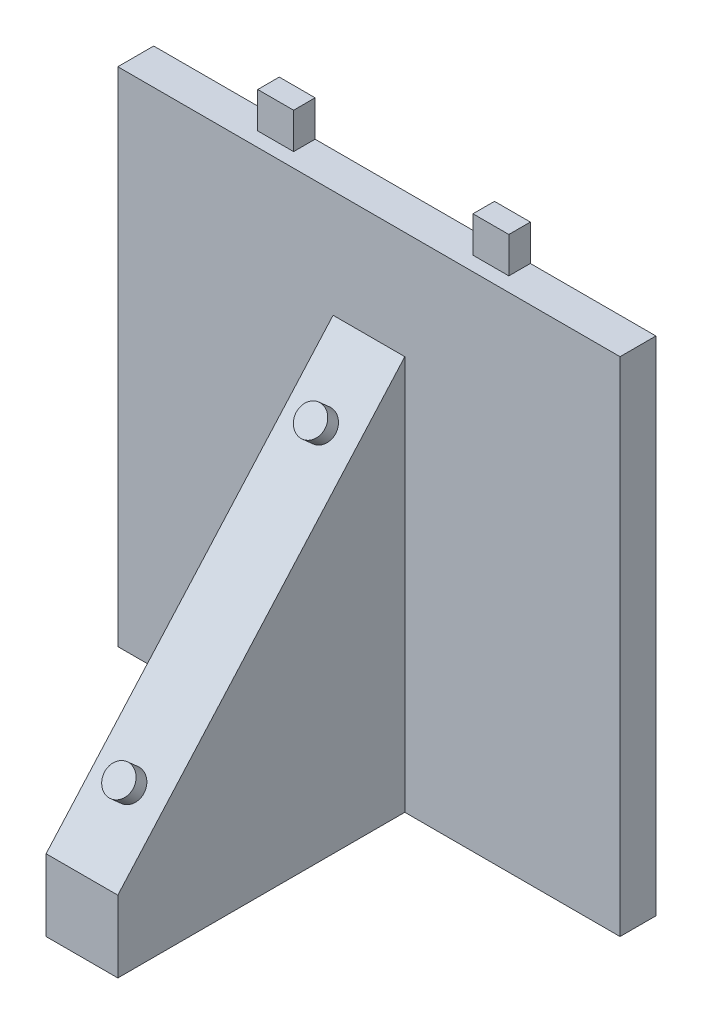
ISO-10303-21;
HEADER;
FILE_DESCRIPTION(('STEP AP214'),'2;1');
FILE_NAME('part.step','',(''),(''),'','','');
FILE_SCHEMA(('AUTOMOTIVE_DESIGN { 1 0 10303 214 1 1 1 1 }'));
ENDSEC;
DATA;
#1=APPLICATION_CONTEXT('core data for automotive mechanical design processes');
#2=APPLICATION_PROTOCOL_DEFINITION('international standard','automotive_design',2000,#1);
#3=PRODUCT_CONTEXT('',#1,'mechanical');
#4=PRODUCT('Part','Part','',(#3));
#5=PRODUCT_RELATED_PRODUCT_CATEGORY('part','',(#4));
#6=PRODUCT_DEFINITION_FORMATION('','',#4);
#7=PRODUCT_DEFINITION_CONTEXT('part definition',#1,'design');
#8=PRODUCT_DEFINITION('design','',#6,#7);
#9=PRODUCT_DEFINITION_SHAPE('','',#8);
#10=(LENGTH_UNIT() NAMED_UNIT(*) SI_UNIT(.MILLI.,.METRE.));
#11=(NAMED_UNIT(*) PLANE_ANGLE_UNIT() SI_UNIT($,.RADIAN.));
#12=(NAMED_UNIT(*) SI_UNIT($,.STERADIAN.) SOLID_ANGLE_UNIT());
#13=UNCERTAINTY_MEASURE_WITH_UNIT(LENGTH_MEASURE(1.E-05),#10,'distance_accuracy_value','');
#14=(GEOMETRIC_REPRESENTATION_CONTEXT(3) GLOBAL_UNCERTAINTY_ASSIGNED_CONTEXT((#13)) GLOBAL_UNIT_ASSIGNED_CONTEXT((#10,
#11,#12)) REPRESENTATION_CONTEXT('',''));
#15=CARTESIAN_POINT('',(0.,0.,0.));
#16=DIRECTION('',(0.,0.,1.));
#17=DIRECTION('',(1.,0.,0.));
#18=AXIS2_PLACEMENT_3D('',#15,#16,#17);
#19=CARTESIAN_POINT('',(0.,0.,5.));
#20=DIRECTION('',(0.,0.,-1.));
#21=DIRECTION('',(-1.,0.,0.));
#22=AXIS2_PLACEMENT_3D('',#19,#20,#21);
#23=PLANE('',#22);
#24=DIRECTION('',(0.,1.,0.));
#25=VECTOR('',#24,1.);
#26=CARTESIAN_POINT('',(5.,-35.,5.));
#27=LINE('',#26,#25);
#28=CARTESIAN_POINT('',(5.,-35.,5.));
#29=VERTEX_POINT('',#28);
#30=CARTESIAN_POINT('',(5.,20.,5.));
#31=VERTEX_POINT('',#30);
#32=EDGE_CURVE('E162',#29,#31,#27,.T.);
#33=ORIENTED_EDGE('',*,*,#32,.F.);
#34=DIRECTION('',(1.,0.,0.));
#35=VECTOR('',#34,1.);
#36=CARTESIAN_POINT('',(35.,-35.,5.));
#37=LINE('',#36,#35);
#38=CARTESIAN_POINT('',(35.,-35.,5.));
#39=VERTEX_POINT('',#38);
#40=EDGE_CURVE('E250',#29,#39,#37,.T.);
#41=ORIENTED_EDGE('',*,*,#40,.T.);
#42=DIRECTION('',(0.,1.,0.));
#43=VECTOR('',#42,1.);
#44=CARTESIAN_POINT('',(35.,-35.,5.));
#45=LINE('',#44,#43);
#46=CARTESIAN_POINT('',(35.,35.,5.));
#47=VERTEX_POINT('',#46);
#48=EDGE_CURVE('E253',#39,#47,#45,.T.);
#49=ORIENTED_EDGE('',*,*,#48,.T.);
#50=DIRECTION('',(-1.,0.,0.));
#51=VECTOR('',#50,1.);
#52=CARTESIAN_POINT('',(35.,35.,5.));
#53=LINE('',#52,#51);
#54=CARTESIAN_POINT('',(-35.,35.,5.));
#55=VERTEX_POINT('',#54);
#56=EDGE_CURVE('E245',#47,#55,#53,.T.);
#57=ORIENTED_EDGE('',*,*,#56,.T.);
#58=DIRECTION('',(0.,-1.,0.));
#59=VECTOR('',#58,1.);
#60=CARTESIAN_POINT('',(-35.,-35.,5.));
#61=LINE('',#60,#59);
#62=CARTESIAN_POINT('',(-35.,-35.,5.));
#63=VERTEX_POINT('',#62);
#64=EDGE_CURVE('E241',#55,#63,#61,.T.);
#65=ORIENTED_EDGE('',*,*,#64,.T.);
#66=CARTESIAN_POINT('',(-5.,-35.,5.));
#67=VERTEX_POINT('',#66);
#68=EDGE_CURVE('E246',#63,#67,#37,.T.);
#69=ORIENTED_EDGE('',*,*,#68,.T.);
#70=DIRECTION('',(0.,1.,0.));
#71=VECTOR('',#70,1.);
#72=CARTESIAN_POINT('',(-5.,-35.,5.));
#73=LINE('',#72,#71);
#74=CARTESIAN_POINT('',(-5.,20.,5.));
#75=VERTEX_POINT('',#74);
#76=EDGE_CURVE('E174',#67,#75,#73,.T.);
#77=ORIENTED_EDGE('',*,*,#76,.T.);
#78=DIRECTION('',(1.,0.,0.));
#79=VECTOR('',#78,1.);
#80=CARTESIAN_POINT('',(-5.,20.,5.));
#81=LINE('',#80,#79);
#82=EDGE_CURVE('E156',#75,#31,#81,.T.);
#83=ORIENTED_EDGE('',*,*,#82,.T.);
#84=EDGE_LOOP('',(#33,#41,#49,#57,#65,#69,#77,#83));
#85=FACE_BOUND('',#84,.T.);
#86=ADVANCED_FACE('F39',(#85),#23,.F.);
#87=CARTESIAN_POINT('',(35.,35.,5.));
#88=DIRECTION('',(0.,-1.,0.));
#89=DIRECTION('',(0.,0.,-1.));
#90=AXIS2_PLACEMENT_3D('',#87,#88,#89);
#91=PLANE('',#90);
#92=DIRECTION('',(0.,0.,1.));
#93=VECTOR('',#92,1.);
#94=CARTESIAN_POINT('',(12.5,35.,0.));
#95=LINE('',#94,#93);
#96=CARTESIAN_POINT('',(12.5,35.,0.));
#97=VERTEX_POINT('',#96);
#98=CARTESIAN_POINT('',(12.5,35.,3.));
#99=VERTEX_POINT('',#98);
#100=EDGE_CURVE('E193',#97,#99,#95,.T.);
#101=ORIENTED_EDGE('',*,*,#100,.F.);
#102=DIRECTION('',(-1.,0.,0.));
#103=VECTOR('',#102,1.);
#104=CARTESIAN_POINT('',(35.,35.,0.));
#105=LINE('',#104,#103);
#106=CARTESIAN_POINT('',(-12.5,35.,0.));
#107=VERTEX_POINT('',#106);
#108=EDGE_CURVE('E260',#97,#107,#105,.T.);
#109=ORIENTED_EDGE('',*,*,#108,.T.);
#110=DIRECTION('',(0.,0.,-1.));
#111=VECTOR('',#110,1.);
#112=CARTESIAN_POINT('',(-12.5,35.,0.));
#113=LINE('',#112,#111);
#114=CARTESIAN_POINT('',(-12.5,35.,3.));
#115=VERTEX_POINT('',#114);
#116=EDGE_CURVE('E227',#115,#107,#113,.T.);
#117=ORIENTED_EDGE('',*,*,#116,.F.);
#118=DIRECTION('',(1.,0.,0.));
#119=VECTOR('',#118,1.);
#120=CARTESIAN_POINT('',(-17.5,35.,3.));
#121=LINE('',#120,#119);
#122=CARTESIAN_POINT('',(-17.5,35.,3.));
#123=VERTEX_POINT('',#122);
#124=EDGE_CURVE('E229',#123,#115,#121,.T.);
#125=ORIENTED_EDGE('',*,*,#124,.F.);
#126=DIRECTION('',(0.,0.,1.));
#127=VECTOR('',#126,1.);
#128=CARTESIAN_POINT('',(-17.5,35.,0.));
#129=LINE('',#128,#127);
#130=CARTESIAN_POINT('',(-17.5,35.,0.));
#131=VERTEX_POINT('',#130);
#132=EDGE_CURVE('E196',#131,#123,#129,.T.);
#133=ORIENTED_EDGE('',*,*,#132,.F.);
#134=CARTESIAN_POINT('',(-35.,35.,0.));
#135=VERTEX_POINT('',#134);
#136=EDGE_CURVE('E215',#131,#135,#105,.T.);
#137=ORIENTED_EDGE('',*,*,#136,.T.);
#138=DIRECTION('',(0.,0.,-1.));
#139=VECTOR('',#138,1.);
#140=CARTESIAN_POINT('',(-35.,35.,5.));
#141=LINE('',#140,#139);
#142=EDGE_CURVE('E11',#55,#135,#141,.T.);
#143=ORIENTED_EDGE('',*,*,#142,.F.);
#144=ORIENTED_EDGE('',*,*,#56,.F.);
#145=DIRECTION('',(0.,0.,-1.));
#146=VECTOR('',#145,1.);
#147=CARTESIAN_POINT('',(35.,35.,5.));
#148=LINE('',#147,#146);
#149=CARTESIAN_POINT('',(35.,35.,0.));
#150=VERTEX_POINT('',#149);
#151=EDGE_CURVE('E251',#47,#150,#148,.T.);
#152=ORIENTED_EDGE('',*,*,#151,.T.);
#153=CARTESIAN_POINT('',(17.5,35.,0.));
#154=VERTEX_POINT('',#153);
#155=EDGE_CURVE('E255',#150,#154,#105,.T.);
#156=ORIENTED_EDGE('',*,*,#155,.T.);
#157=DIRECTION('',(0.,0.,-1.));
#158=VECTOR('',#157,1.);
#159=CARTESIAN_POINT('',(17.5,35.,0.));
#160=LINE('',#159,#158);
#161=CARTESIAN_POINT('',(17.5,35.,3.));
#162=VERTEX_POINT('',#161);
#163=EDGE_CURVE('E188',#162,#154,#160,.T.);
#164=ORIENTED_EDGE('',*,*,#163,.F.);
#165=DIRECTION('',(1.,0.,0.));
#166=VECTOR('',#165,1.);
#167=CARTESIAN_POINT('',(17.5,35.,3.));
#168=LINE('',#167,#166);
#169=EDGE_CURVE('E65',#99,#162,#168,.T.);
#170=ORIENTED_EDGE('',*,*,#169,.F.);
#171=EDGE_LOOP('',(#101,#109,#117,#125,#133,#137,#143,#144,#152,#156,#164,#170));
#172=FACE_BOUND('',#171,.T.);
#173=ADVANCED_FACE('F41',(#172),#91,.F.);
#174=CARTESIAN_POINT('',(-35.,-35.,5.));
#175=DIRECTION('',(1.,0.,0.));
#176=DIRECTION('',(0.,0.,-1.));
#177=AXIS2_PLACEMENT_3D('',#174,#175,#176);
#178=PLANE('',#177);
#179=DIRECTION('',(0.,-1.,0.));
#180=VECTOR('',#179,1.);
#181=CARTESIAN_POINT('',(-35.,-35.,0.));
#182=LINE('',#181,#180);
#183=CARTESIAN_POINT('',(-35.,-35.,0.));
#184=VERTEX_POINT('',#183);
#185=EDGE_CURVE('E258',#135,#184,#182,.T.);
#186=ORIENTED_EDGE('',*,*,#185,.T.);
#187=DIRECTION('',(0.,0.,-1.));
#188=VECTOR('',#187,1.);
#189=CARTESIAN_POINT('',(-35.,-35.,5.));
#190=LINE('',#189,#188);
#191=EDGE_CURVE('E50',#63,#184,#190,.T.);
#192=ORIENTED_EDGE('',*,*,#191,.F.);
#193=ORIENTED_EDGE('',*,*,#64,.F.);
#194=ORIENTED_EDGE('',*,*,#142,.T.);
#195=EDGE_LOOP('',(#186,#192,#193,#194));
#196=FACE_BOUND('',#195,.T.);
#197=ADVANCED_FACE('F312',(#196),#178,.F.);
#198=CARTESIAN_POINT('',(35.,-35.,5.));
#199=DIRECTION('',(0.,1.,0.));
#200=DIRECTION('',(0.,0.,1.));
#201=AXIS2_PLACEMENT_3D('',#198,#199,#200);
#202=PLANE('',#201);
#203=DIRECTION('',(1.,0.,0.));
#204=VECTOR('',#203,1.);
#205=CARTESIAN_POINT('',(35.,-35.,0.));
#206=LINE('',#205,#204);
#207=CARTESIAN_POINT('',(35.,-35.,0.));
#208=VERTEX_POINT('',#207);
#209=EDGE_CURVE('E259',#184,#208,#206,.T.);
#210=ORIENTED_EDGE('',*,*,#209,.T.);
#211=DIRECTION('',(0.,0.,-1.));
#212=VECTOR('',#211,1.);
#213=CARTESIAN_POINT('',(35.,-35.,5.));
#214=LINE('',#213,#212);
#215=EDGE_CURVE('E262',#39,#208,#214,.T.);
#216=ORIENTED_EDGE('',*,*,#215,.F.);
#217=ORIENTED_EDGE('',*,*,#40,.F.);
#218=DIRECTION('',(0.,0.,-1.));
#219=VECTOR('',#218,1.);
#220=CARTESIAN_POINT('',(5.,-35.,45.));
#221=LINE('',#220,#219);
#222=CARTESIAN_POINT('',(5.,-35.,45.));
#223=VERTEX_POINT('',#222);
#224=EDGE_CURVE('E169',#223,#29,#221,.T.);
#225=ORIENTED_EDGE('',*,*,#224,.F.);
#226=DIRECTION('',(1.,0.,0.));
#227=VECTOR('',#226,1.);
#228=CARTESIAN_POINT('',(-5.,-35.,45.));
#229=LINE('',#228,#227);
#230=CARTESIAN_POINT('',(-5.,-35.,45.));
#231=VERTEX_POINT('',#230);
#232=EDGE_CURVE('E179',#231,#223,#229,.T.);
#233=ORIENTED_EDGE('',*,*,#232,.F.);
#234=DIRECTION('',(0.,0.,-1.));
#235=VECTOR('',#234,1.);
#236=CARTESIAN_POINT('',(-5.,-35.,45.));
#237=LINE('',#236,#235);
#238=EDGE_CURVE('E171',#231,#67,#237,.T.);
#239=ORIENTED_EDGE('',*,*,#238,.T.);
#240=ORIENTED_EDGE('',*,*,#68,.F.);
#241=ORIENTED_EDGE('',*,*,#191,.T.);
#242=EDGE_LOOP('',(#210,#216,#217,#225,#233,#239,#240,#241));
#243=FACE_BOUND('',#242,.T.);
#244=ADVANCED_FACE('F271',(#243),#202,.F.);
#245=CARTESIAN_POINT('',(35.,-35.,5.));
#246=DIRECTION('',(-1.,0.,0.));
#247=DIRECTION('',(0.,0.,1.));
#248=AXIS2_PLACEMENT_3D('',#245,#246,#247);
#249=PLANE('',#248);
#250=DIRECTION('',(0.,1.,0.));
#251=VECTOR('',#250,1.);
#252=CARTESIAN_POINT('',(35.,-35.,0.));
#253=LINE('',#252,#251);
#254=EDGE_CURVE('E247',#208,#150,#253,.T.);
#255=ORIENTED_EDGE('',*,*,#254,.T.);
#256=ORIENTED_EDGE('',*,*,#151,.F.);
#257=ORIENTED_EDGE('',*,*,#48,.F.);
#258=ORIENTED_EDGE('',*,*,#215,.T.);
#259=EDGE_LOOP('',(#255,#256,#257,#258));
#260=FACE_BOUND('',#259,.T.);
#261=ADVANCED_FACE('F285',(#260),#249,.F.);
#262=CARTESIAN_POINT('',(0.,0.,0.));
#263=DIRECTION('',(0.,0.,-1.));
#264=DIRECTION('',(-1.,0.,0.));
#265=AXIS2_PLACEMENT_3D('',#262,#263,#264);
#266=PLANE('',#265);
#267=ORIENTED_EDGE('',*,*,#155,.F.);
#268=ORIENTED_EDGE('',*,*,#254,.F.);
#269=ORIENTED_EDGE('',*,*,#209,.F.);
#270=ORIENTED_EDGE('',*,*,#185,.F.);
#271=ORIENTED_EDGE('',*,*,#136,.F.);
#272=DIRECTION('',(0.,-1.,0.));
#273=VECTOR('',#272,1.);
#274=CARTESIAN_POINT('',(-17.5,40.,0.));
#275=LINE('',#274,#273);
#276=CARTESIAN_POINT('',(-17.5,40.,0.));
#277=VERTEX_POINT('',#276);
#278=EDGE_CURVE('E225',#277,#131,#275,.T.);
#279=ORIENTED_EDGE('',*,*,#278,.F.);
#280=DIRECTION('',(-1.,0.,0.));
#281=VECTOR('',#280,1.);
#282=CARTESIAN_POINT('',(-17.5,40.,0.));
#283=LINE('',#282,#281);
#284=CARTESIAN_POINT('',(-12.5,40.,0.));
#285=VERTEX_POINT('',#284);
#286=EDGE_CURVE('E223',#285,#277,#283,.T.);
#287=ORIENTED_EDGE('',*,*,#286,.F.);
#288=DIRECTION('',(0.,-1.,0.));
#289=VECTOR('',#288,1.);
#290=CARTESIAN_POINT('',(-12.5,40.,0.));
#291=LINE('',#290,#289);
#292=EDGE_CURVE('E218',#285,#107,#291,.T.);
#293=ORIENTED_EDGE('',*,*,#292,.T.);
#294=ORIENTED_EDGE('',*,*,#108,.F.);
#295=DIRECTION('',(0.,-1.,0.));
#296=VECTOR('',#295,1.);
#297=CARTESIAN_POINT('',(12.5,40.,0.));
#298=LINE('',#297,#296);
#299=CARTESIAN_POINT('',(12.5,40.,0.));
#300=VERTEX_POINT('',#299);
#301=EDGE_CURVE('E191',#300,#97,#298,.T.);
#302=ORIENTED_EDGE('',*,*,#301,.F.);
#303=DIRECTION('',(-1.,0.,0.));
#304=VECTOR('',#303,1.);
#305=CARTESIAN_POINT('',(17.5,40.,0.));
#306=LINE('',#305,#304);
#307=CARTESIAN_POINT('',(17.5,40.,0.));
#308=VERTEX_POINT('',#307);
#309=EDGE_CURVE('E194',#308,#300,#306,.T.);
#310=ORIENTED_EDGE('',*,*,#309,.F.);
#311=DIRECTION('',(0.,-1.,0.));
#312=VECTOR('',#311,1.);
#313=CARTESIAN_POINT('',(17.5,40.,0.));
#314=LINE('',#313,#312);
#315=EDGE_CURVE('E204',#308,#154,#314,.T.);
#316=ORIENTED_EDGE('',*,*,#315,.T.);
#317=EDGE_LOOP('',(#267,#268,#269,#270,#271,#279,#287,#293,#294,#302,#310,#316));
#318=FACE_BOUND('',#317,.T.);
#319=ADVANCED_FACE('F279',(#318),#266,.T.);
#320=CARTESIAN_POINT('',(-17.5,40.,0.));
#321=DIRECTION('',(1.,0.,0.));
#322=DIRECTION('',(0.,0.,-1.));
#323=AXIS2_PLACEMENT_3D('',#320,#321,#322);
#324=PLANE('',#323);
#325=ORIENTED_EDGE('',*,*,#132,.T.);
#326=DIRECTION('',(0.,-1.,0.));
#327=VECTOR('',#326,1.);
#328=CARTESIAN_POINT('',(-17.5,40.,3.));
#329=LINE('',#328,#327);
#330=CARTESIAN_POINT('',(-17.5,40.,3.));
#331=VERTEX_POINT('',#330);
#332=EDGE_CURVE('E213',#331,#123,#329,.T.);
#333=ORIENTED_EDGE('',*,*,#332,.F.);
#334=DIRECTION('',(0.,0.,1.));
#335=VECTOR('',#334,1.);
#336=CARTESIAN_POINT('',(-17.5,40.,0.));
#337=LINE('',#336,#335);
#338=EDGE_CURVE('E226',#277,#331,#337,.T.);
#339=ORIENTED_EDGE('',*,*,#338,.F.);
#340=ORIENTED_EDGE('',*,*,#278,.T.);
#341=EDGE_LOOP('',(#325,#333,#339,#340));
#342=FACE_BOUND('',#341,.T.);
#343=ADVANCED_FACE('F325',(#342),#324,.F.);
#344=CARTESIAN_POINT('',(-17.5,40.,3.));
#345=DIRECTION('',(0.,0.,-1.));
#346=DIRECTION('',(-1.,0.,0.));
#347=AXIS2_PLACEMENT_3D('',#344,#345,#346);
#348=PLANE('',#347);
#349=ORIENTED_EDGE('',*,*,#124,.T.);
#350=DIRECTION('',(0.,-1.,0.));
#351=VECTOR('',#350,1.);
#352=CARTESIAN_POINT('',(-12.5,40.,3.));
#353=LINE('',#352,#351);
#354=CARTESIAN_POINT('',(-12.5,40.,3.));
#355=VERTEX_POINT('',#354);
#356=EDGE_CURVE('E216',#355,#115,#353,.T.);
#357=ORIENTED_EDGE('',*,*,#356,.F.);
#358=DIRECTION('',(1.,0.,0.));
#359=VECTOR('',#358,1.);
#360=CARTESIAN_POINT('',(-17.5,40.,3.));
#361=LINE('',#360,#359);
#362=EDGE_CURVE('E236',#331,#355,#361,.T.);
#363=ORIENTED_EDGE('',*,*,#362,.F.);
#364=ORIENTED_EDGE('',*,*,#332,.T.);
#365=EDGE_LOOP('',(#349,#357,#363,#364));
#366=FACE_BOUND('',#365,.T.);
#367=ADVANCED_FACE('F355',(#366),#348,.F.);
#368=CARTESIAN_POINT('',(-12.5,40.,0.));
#369=DIRECTION('',(-1.,0.,0.));
#370=DIRECTION('',(0.,0.,1.));
#371=AXIS2_PLACEMENT_3D('',#368,#369,#370);
#372=PLANE('',#371);
#373=ORIENTED_EDGE('',*,*,#116,.T.);
#374=ORIENTED_EDGE('',*,*,#292,.F.);
#375=DIRECTION('',(0.,0.,-1.));
#376=VECTOR('',#375,1.);
#377=CARTESIAN_POINT('',(-12.5,40.,0.));
#378=LINE('',#377,#376);
#379=EDGE_CURVE('E237',#355,#285,#378,.T.);
#380=ORIENTED_EDGE('',*,*,#379,.F.);
#381=ORIENTED_EDGE('',*,*,#356,.T.);
#382=EDGE_LOOP('',(#373,#374,#380,#381));
#383=FACE_BOUND('',#382,.T.);
#384=ADVANCED_FACE('F363',(#383),#372,.F.);
#385=CARTESIAN_POINT('',(0.,40.,0.));
#386=DIRECTION('',(0.,1.,0.));
#387=DIRECTION('',(0.,0.,1.));
#388=AXIS2_PLACEMENT_3D('',#385,#386,#387);
#389=PLANE('',#388);
#390=ORIENTED_EDGE('',*,*,#338,.T.);
#391=ORIENTED_EDGE('',*,*,#362,.T.);
#392=ORIENTED_EDGE('',*,*,#379,.T.);
#393=ORIENTED_EDGE('',*,*,#286,.T.);
#394=EDGE_LOOP('',(#390,#391,#392,#393));
#395=FACE_BOUND('',#394,.T.);
#396=ADVANCED_FACE('F318',(#395),#389,.T.);
#397=CARTESIAN_POINT('',(12.5,40.,0.));
#398=DIRECTION('',(1.,0.,0.));
#399=DIRECTION('',(0.,0.,-1.));
#400=AXIS2_PLACEMENT_3D('',#397,#398,#399);
#401=PLANE('',#400);
#402=ORIENTED_EDGE('',*,*,#100,.T.);
#403=DIRECTION('',(0.,-1.,0.));
#404=VECTOR('',#403,1.);
#405=CARTESIAN_POINT('',(12.5,40.,3.));
#406=LINE('',#405,#404);
#407=CARTESIAN_POINT('',(12.5,40.,3.));
#408=VERTEX_POINT('',#407);
#409=EDGE_CURVE('E209',#408,#99,#406,.T.);
#410=ORIENTED_EDGE('',*,*,#409,.F.);
#411=DIRECTION('',(0.,0.,1.));
#412=VECTOR('',#411,1.);
#413=CARTESIAN_POINT('',(12.5,40.,0.));
#414=LINE('',#413,#412);
#415=EDGE_CURVE('E184',#300,#408,#414,.T.);
#416=ORIENTED_EDGE('',*,*,#415,.F.);
#417=ORIENTED_EDGE('',*,*,#301,.T.);
#418=EDGE_LOOP('',(#402,#410,#416,#417));
#419=FACE_BOUND('',#418,.T.);
#420=ADVANCED_FACE('F380',(#419),#401,.F.);
#421=CARTESIAN_POINT('',(17.5,40.,3.));
#422=DIRECTION('',(0.,0.,-1.));
#423=DIRECTION('',(-1.,0.,0.));
#424=AXIS2_PLACEMENT_3D('',#421,#422,#423);
#425=PLANE('',#424);
#426=ORIENTED_EDGE('',*,*,#169,.T.);
#427=DIRECTION('',(0.,-1.,0.));
#428=VECTOR('',#427,1.);
#429=CARTESIAN_POINT('',(17.5,40.,3.));
#430=LINE('',#429,#428);
#431=CARTESIAN_POINT('',(17.5,40.,3.));
#432=VERTEX_POINT('',#431);
#433=EDGE_CURVE('E210',#432,#162,#430,.T.);
#434=ORIENTED_EDGE('',*,*,#433,.F.);
#435=DIRECTION('',(1.,0.,0.));
#436=VECTOR('',#435,1.);
#437=CARTESIAN_POINT('',(17.5,40.,3.));
#438=LINE('',#437,#436);
#439=EDGE_CURVE('E190',#408,#432,#438,.T.);
#440=ORIENTED_EDGE('',*,*,#439,.F.);
#441=ORIENTED_EDGE('',*,*,#409,.T.);
#442=EDGE_LOOP('',(#426,#434,#440,#441));
#443=FACE_BOUND('',#442,.T.);
#444=ADVANCED_FACE('F384',(#443),#425,.F.);
#445=CARTESIAN_POINT('',(17.5,40.,0.));
#446=DIRECTION('',(-1.,0.,0.));
#447=DIRECTION('',(0.,0.,1.));
#448=AXIS2_PLACEMENT_3D('',#445,#446,#447);
#449=PLANE('',#448);
#450=ORIENTED_EDGE('',*,*,#163,.T.);
#451=ORIENTED_EDGE('',*,*,#315,.F.);
#452=DIRECTION('',(0.,0.,-1.));
#453=VECTOR('',#452,1.);
#454=CARTESIAN_POINT('',(17.5,40.,0.));
#455=LINE('',#454,#453);
#456=EDGE_CURVE('E186',#432,#308,#455,.T.);
#457=ORIENTED_EDGE('',*,*,#456,.F.);
#458=ORIENTED_EDGE('',*,*,#433,.T.);
#459=EDGE_LOOP('',(#450,#451,#457,#458));
#460=FACE_BOUND('',#459,.T.);
#461=ADVANCED_FACE('F394',(#460),#449,.F.);
#462=CARTESIAN_POINT('',(0.,40.,0.));
#463=DIRECTION('',(0.,-1.,0.));
#464=DIRECTION('',(0.,0.,-1.));
#465=AXIS2_PLACEMENT_3D('',#462,#463,#464);
#466=PLANE('',#465);
#467=ORIENTED_EDGE('',*,*,#415,.T.);
#468=ORIENTED_EDGE('',*,*,#439,.T.);
#469=ORIENTED_EDGE('',*,*,#456,.T.);
#470=ORIENTED_EDGE('',*,*,#309,.T.);
#471=EDGE_LOOP('',(#467,#468,#469,#470));
#472=FACE_BOUND('',#471,.T.);
#473=ADVANCED_FACE('F405',(#472),#466,.F.);
#474=CARTESIAN_POINT('',(-5.,-25.,45.));
#475=DIRECTION('',(0.,0.,1.));
#476=DIRECTION('',(1.,0.,0.));
#477=AXIS2_PLACEMENT_3D('',#474,#475,#476);
#478=PLANE('',#477);
#479=ORIENTED_EDGE('',*,*,#232,.T.);
#480=DIRECTION('',(0.,-1.,0.));
#481=VECTOR('',#480,1.);
#482=CARTESIAN_POINT('',(5.,-25.,45.));
#483=LINE('',#482,#481);
#484=CARTESIAN_POINT('',(5.,-25.,45.));
#485=VERTEX_POINT('',#484);
#486=EDGE_CURVE('E165',#485,#223,#483,.T.);
#487=ORIENTED_EDGE('',*,*,#486,.F.);
#488=DIRECTION('',(1.,0.,0.));
#489=VECTOR('',#488,1.);
#490=CARTESIAN_POINT('',(-5.,-25.,45.));
#491=LINE('',#490,#489);
#492=CARTESIAN_POINT('',(-5.,-25.,45.));
#493=VERTEX_POINT('',#492);
#494=EDGE_CURVE('E158',#493,#485,#491,.T.);
#495=ORIENTED_EDGE('',*,*,#494,.F.);
#496=DIRECTION('',(0.,-1.,0.));
#497=VECTOR('',#496,1.);
#498=CARTESIAN_POINT('',(-5.,-25.,45.));
#499=LINE('',#498,#497);
#500=EDGE_CURVE('E178',#493,#231,#499,.T.);
#501=ORIENTED_EDGE('',*,*,#500,.T.);
#502=EDGE_LOOP('',(#479,#487,#495,#501));
#503=FACE_BOUND('',#502,.T.);
#504=ADVANCED_FACE('F291',(#503),#478,.T.);
#505=CARTESIAN_POINT('',(-5.,20.,5.));
#506=DIRECTION('',(0.,0.66436383882992,0.74740931868366));
#507=DIRECTION('',(0.,-0.74740931868366,0.66436383882992));
#508=AXIS2_PLACEMENT_3D('',#505,#506,#507);
#509=PLANE('',#508);
#510=CARTESIAN_POINT('',(0.,12.5259068131634,11.6436383882992));
#511=DIRECTION('',(0.,0.66436383882992,0.74740931868366));
#512=DIRECTION('',(0.,-0.74740931868366,0.66436383882992));
#513=AXIS2_PLACEMENT_3D('',#510,#511,#512);
#514=CIRCLE('',#513,2.);
#515=CARTESIAN_POINT('',(0.,11.0310881757961,12.972366065959));
#516=VERTEX_POINT('',#515);
#517=EDGE_CURVE('E489',#516,#516,#514,.T.);
#518=ORIENTED_EDGE('',*,*,#517,.F.);
#519=EDGE_LOOP('',(#518));
#520=FACE_BOUND('',#519,.T.);
#521=CARTESIAN_POINT('',(0.,-17.5259068131634,38.3563616117008));
#522=DIRECTION('',(0.,0.66436383882992,0.74740931868366));
#523=DIRECTION('',(0.,-0.74740931868366,0.66436383882992));
#524=AXIS2_PLACEMENT_3D('',#521,#522,#523);
#525=CIRCLE('',#524,2.);
#526=CARTESIAN_POINT('',(0.,-19.0207254505307,39.6850892893606));
#527=VERTEX_POINT('',#526);
#528=EDGE_CURVE('E492',#527,#527,#525,.T.);
#529=ORIENTED_EDGE('',*,*,#528,.F.);
#530=EDGE_LOOP('',(#529));
#531=FACE_BOUND('',#530,.T.);
#532=ORIENTED_EDGE('',*,*,#494,.T.);
#533=DIRECTION('',(0.,-0.74740931868366,0.66436383882992));
#534=VECTOR('',#533,1.);
#535=CARTESIAN_POINT('',(5.,20.,5.));
#536=LINE('',#535,#534);
#537=EDGE_CURVE('E155',#31,#485,#536,.T.);
#538=ORIENTED_EDGE('',*,*,#537,.F.);
#539=ORIENTED_EDGE('',*,*,#82,.F.);
#540=DIRECTION('',(0.,-0.74740931868366,0.66436383882992));
#541=VECTOR('',#540,1.);
#542=CARTESIAN_POINT('',(-5.,20.,5.));
#543=LINE('',#542,#541);
#544=EDGE_CURVE('E53',#75,#493,#543,.T.);
#545=ORIENTED_EDGE('',*,*,#544,.T.);
#546=EDGE_LOOP('',(#532,#538,#539,#545));
#547=FACE_BOUND('',#546,.T.);
#548=ADVANCED_FACE('F152',(#520,#531,#547),#509,.T.);
#549=CARTESIAN_POINT('',(-5.,0.,0.));
#550=DIRECTION('',(-1.,0.,0.));
#551=DIRECTION('',(0.,0.,1.));
#552=AXIS2_PLACEMENT_3D('',#549,#550,#551);
#553=PLANE('',#552);
#554=ORIENTED_EDGE('',*,*,#76,.F.);
#555=ORIENTED_EDGE('',*,*,#238,.F.);
#556=ORIENTED_EDGE('',*,*,#500,.F.);
#557=ORIENTED_EDGE('',*,*,#544,.F.);
#558=EDGE_LOOP('',(#554,#555,#556,#557));
#559=FACE_BOUND('',#558,.T.);
#560=ADVANCED_FACE('F293',(#559),#553,.T.);
#561=CARTESIAN_POINT('',(5.,0.,0.));
#562=DIRECTION('',(-1.,0.,0.));
#563=DIRECTION('',(0.,0.,1.));
#564=AXIS2_PLACEMENT_3D('',#561,#562,#563);
#565=PLANE('',#564);
#566=ORIENTED_EDGE('',*,*,#32,.T.);
#567=ORIENTED_EDGE('',*,*,#537,.T.);
#568=ORIENTED_EDGE('',*,*,#486,.T.);
#569=ORIENTED_EDGE('',*,*,#224,.T.);
#570=EDGE_LOOP('',(#566,#567,#568,#569));
#571=FACE_BOUND('',#570,.T.);
#572=ADVANCED_FACE('F167',(#571),#565,.F.);
#573=CARTESIAN_POINT('',(0.,-16.1971791355036,39.8511802490681));
#574=DIRECTION('',(0.,-0.66436383882992,-0.74740931868366));
#575=DIRECTION('',(0.,0.74740931868366,-0.66436383882992));
#576=AXIS2_PLACEMENT_3D('',#573,#574,#575);
#577=CYLINDRICAL_SURFACE('',#576,2.);
#578=CARTESIAN_POINT('',(0.,-16.1971791355036,39.8511802490681));
#579=DIRECTION('',(0.,0.66436383882992,0.74740931868366));
#580=DIRECTION('',(0.,-0.74740931868366,0.66436383882992));
#581=AXIS2_PLACEMENT_3D('',#578,#579,#580);
#582=CIRCLE('',#581,2.);
#583=CARTESIAN_POINT('',(0.,-17.6919977728709,41.1799079267279));
#584=VERTEX_POINT('',#583);
#585=EDGE_CURVE('E499',#584,#584,#582,.T.);
#586=ORIENTED_EDGE('',*,*,#585,.F.);
#587=EDGE_LOOP('',(#586));
#588=FACE_BOUND('',#587,.T.);
#589=ORIENTED_EDGE('',*,*,#528,.T.);
#590=EDGE_LOOP('',(#589));
#591=FACE_BOUND('',#590,.T.);
#592=ADVANCED_FACE('F304',(#588,#591),#577,.T.);
#593=CARTESIAN_POINT('',(0.,-16.1971791355036,39.8511802490681));
#594=DIRECTION('',(0.,0.66436383882992,0.74740931868366));
#595=DIRECTION('',(0.,-0.74740931868366,0.66436383882992));
#596=AXIS2_PLACEMENT_3D('',#593,#594,#595);
#597=PLANE('',#596);
#598=ORIENTED_EDGE('',*,*,#585,.T.);
#599=EDGE_LOOP('',(#598));
#600=FACE_BOUND('',#599,.T.);
#601=ADVANCED_FACE('F453',(#600),#597,.T.);
#602=CARTESIAN_POINT('',(0.,13.8546344908232,13.1384570256665));
#603=DIRECTION('',(0.,-0.66436383882992,-0.74740931868366));
#604=DIRECTION('',(0.,0.74740931868366,-0.66436383882992));
#605=AXIS2_PLACEMENT_3D('',#602,#603,#604);
#606=CYLINDRICAL_SURFACE('',#605,2.);
#607=CARTESIAN_POINT('',(0.,13.8546344908232,13.1384570256665));
#608=DIRECTION('',(0.,0.66436383882992,0.74740931868366));
#609=DIRECTION('',(0.,-0.74740931868366,0.66436383882992));
#610=AXIS2_PLACEMENT_3D('',#607,#608,#609);
#611=CIRCLE('',#610,2.);
#612=CARTESIAN_POINT('',(0.,12.3598158534559,14.4671847033264));
#613=VERTEX_POINT('',#612);
#614=EDGE_CURVE('E172',#613,#613,#611,.T.);
#615=ORIENTED_EDGE('',*,*,#614,.F.);
#616=EDGE_LOOP('',(#615));
#617=FACE_BOUND('',#616,.T.);
#618=ORIENTED_EDGE('',*,*,#517,.T.);
#619=EDGE_LOOP('',(#618));
#620=FACE_BOUND('',#619,.T.);
#621=ADVANCED_FACE('F461',(#617,#620),#606,.T.);
#622=CARTESIAN_POINT('',(0.,13.8546344908232,13.1384570256665));
#623=DIRECTION('',(0.,0.66436383882992,0.74740931868366));
#624=DIRECTION('',(0.,-0.74740931868366,0.66436383882992));
#625=AXIS2_PLACEMENT_3D('',#622,#623,#624);
#626=PLANE('',#625);
#627=ORIENTED_EDGE('',*,*,#614,.T.);
#628=EDGE_LOOP('',(#627));
#629=FACE_BOUND('',#628,.T.);
#630=ADVANCED_FACE('F474',(#629),#626,.T.);
#631=CLOSED_SHELL('',(#86,#173,#197,#244,#261,#319,#343,#367,#384,#396,#420,#444,#461,#473,#504,
#548,#560,#572,#592,#601,#621,#630));
#632=MANIFOLD_SOLID_BREP('B2',#631);
#633=ADVANCED_BREP_SHAPE_REPRESENTATION('',(#18,#632),#14);
#634=SHAPE_DEFINITION_REPRESENTATION(#9,#633);
ENDSEC;
END-ISO-10303-21;
